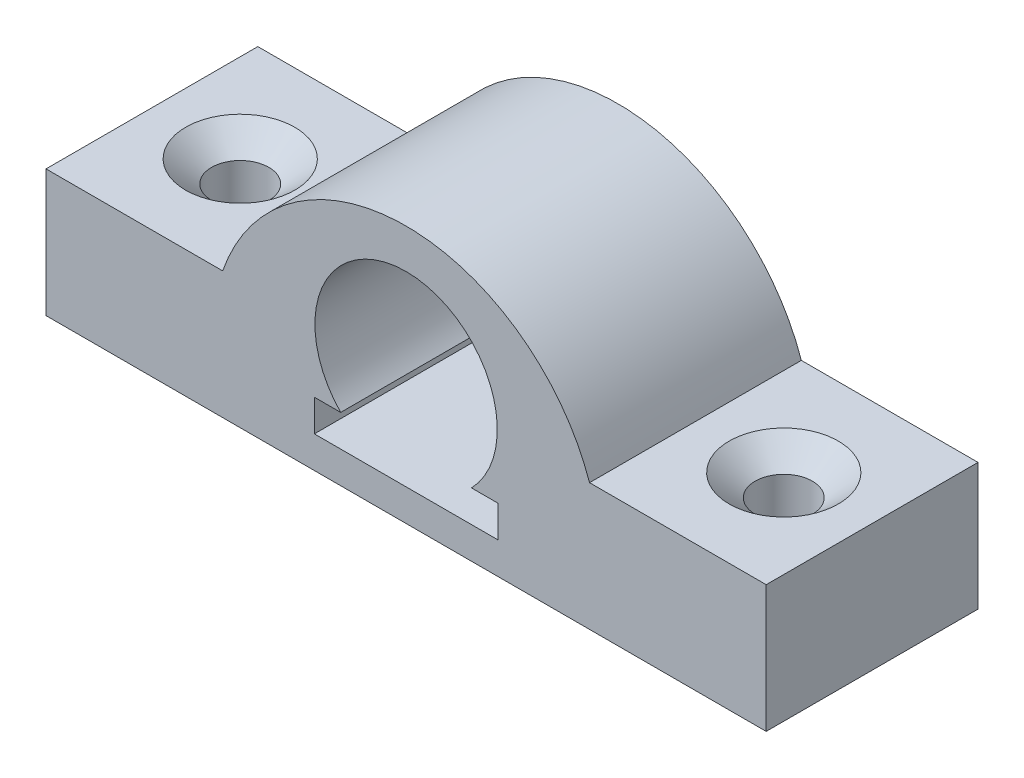
ISO-10303-21;
HEADER;
FILE_DESCRIPTION(('STEP AP214'),'2;1');
FILE_NAME('part.step','',(''),(''),'','','');
FILE_SCHEMA(('AUTOMOTIVE_DESIGN { 1 0 10303 214 1 1 1 1 }'));
ENDSEC;
DATA;
#1=APPLICATION_CONTEXT('core data for automotive mechanical design processes');
#2=APPLICATION_PROTOCOL_DEFINITION('international standard','automotive_design',2000,#1);
#3=PRODUCT_CONTEXT('',#1,'mechanical');
#4=PRODUCT('Part','Part','',(#3));
#5=PRODUCT_RELATED_PRODUCT_CATEGORY('part','',(#4));
#6=PRODUCT_DEFINITION_FORMATION('','',#4);
#7=PRODUCT_DEFINITION_CONTEXT('part definition',#1,'design');
#8=PRODUCT_DEFINITION('design','',#6,#7);
#9=PRODUCT_DEFINITION_SHAPE('','',#8);
#10=(LENGTH_UNIT() NAMED_UNIT(*) SI_UNIT(.MILLI.,.METRE.));
#11=(NAMED_UNIT(*) PLANE_ANGLE_UNIT() SI_UNIT($,.RADIAN.));
#12=(NAMED_UNIT(*) SI_UNIT($,.STERADIAN.) SOLID_ANGLE_UNIT());
#13=UNCERTAINTY_MEASURE_WITH_UNIT(LENGTH_MEASURE(1.E-05),#10,'distance_accuracy_value','');
#14=(GEOMETRIC_REPRESENTATION_CONTEXT(3) GLOBAL_UNCERTAINTY_ASSIGNED_CONTEXT((#13)) GLOBAL_UNIT_ASSIGNED_CONTEXT((#10,
#11,#12)) REPRESENTATION_CONTEXT('',''));
#15=CARTESIAN_POINT('',(0.,0.,0.));
#16=DIRECTION('',(0.,0.,1.));
#17=DIRECTION('',(1.,0.,0.));
#18=AXIS2_PLACEMENT_3D('',#15,#16,#17);
#19=CARTESIAN_POINT('',(0.,15.,0.));
#20=DIRECTION('',(0.,1.,0.));
#21=DIRECTION('',(0.,0.,1.));
#22=AXIS2_PLACEMENT_3D('',#19,#20,#21);
#23=PLANE('',#22);
#24=CARTESIAN_POINT('',(10.4246824526945,15.,-12.5));
#25=DIRECTION('',(0.,1.,0.));
#26=DIRECTION('',(0.,0.,1.));
#27=AXIS2_PLACEMENT_3D('',#24,#25,#26);
#28=CIRCLE('',#27,6.4389);
#29=CARTESIAN_POINT('',(10.4246824526945,15.,-6.06110000000001));
#30=VERTEX_POINT('',#29);
#31=EDGE_CURVE('E171',#30,#30,#28,.T.);
#32=ORIENTED_EDGE('',*,*,#31,.F.);
#33=EDGE_LOOP('',(#32));
#34=FACE_BOUND('',#33,.T.);
#35=DIRECTION('',(0.,0.,1.));
#36=VECTOR('',#35,1.);
#37=CARTESIAN_POINT('',(20.8493649053889,15.,-25.));
#38=LINE('',#37,#36);
#39=CARTESIAN_POINT('',(20.8493649053889,15.,-25.));
#40=VERTEX_POINT('',#39);
#41=CARTESIAN_POINT('',(20.8493649053889,15.,0.));
#42=VERTEX_POINT('',#41);
#43=EDGE_CURVE('E210',#40,#42,#38,.T.);
#44=ORIENTED_EDGE('',*,*,#43,.F.);
#45=DIRECTION('',(-1.,0.,0.));
#46=VECTOR('',#45,1.);
#47=CARTESIAN_POINT('',(85.,15.,-25.));
#48=LINE('',#47,#46);
#49=CARTESIAN_POINT('',(0.,15.,-25.));
#50=VERTEX_POINT('',#49);
#51=EDGE_CURVE('E234',#40,#50,#48,.T.);
#52=ORIENTED_EDGE('',*,*,#51,.T.);
#53=DIRECTION('',(0.,0.,1.));
#54=VECTOR('',#53,1.);
#55=CARTESIAN_POINT('',(0.,15.,-25.));
#56=LINE('',#55,#54);
#57=CARTESIAN_POINT('',(0.,15.,0.));
#58=VERTEX_POINT('',#57);
#59=EDGE_CURVE('E222',#50,#58,#56,.T.);
#60=ORIENTED_EDGE('',*,*,#59,.T.);
#61=DIRECTION('',(1.,0.,0.));
#62=VECTOR('',#61,1.);
#63=CARTESIAN_POINT('',(0.,15.,0.));
#64=LINE('',#63,#62);
#65=EDGE_CURVE('E228',#58,#42,#64,.T.);
#66=ORIENTED_EDGE('',*,*,#65,.T.);
#67=EDGE_LOOP('',(#44,#52,#60,#66));
#68=FACE_BOUND('',#67,.T.);
#69=ADVANCED_FACE('F45',(#34,#68),#23,.T.);
#70=CARTESIAN_POINT('',(0.,15.,-25.));
#71=DIRECTION('',(1.,0.,0.));
#72=DIRECTION('',(0.,0.,-1.));
#73=AXIS2_PLACEMENT_3D('',#70,#71,#72);
#74=PLANE('',#73);
#75=DIRECTION('',(0.,0.,1.));
#76=VECTOR('',#75,1.);
#77=CARTESIAN_POINT('',(0.,0.,-25.));
#78=LINE('',#77,#76);
#79=CARTESIAN_POINT('',(0.,0.,-25.));
#80=VERTEX_POINT('',#79);
#81=CARTESIAN_POINT('',(0.,0.,0.));
#82=VERTEX_POINT('',#81);
#83=EDGE_CURVE('E218',#80,#82,#78,.T.);
#84=ORIENTED_EDGE('',*,*,#83,.T.);
#85=DIRECTION('',(0.,-1.,0.));
#86=VECTOR('',#85,1.);
#87=CARTESIAN_POINT('',(0.,15.,0.));
#88=LINE('',#87,#86);
#89=EDGE_CURVE('E261',#58,#82,#88,.T.);
#90=ORIENTED_EDGE('',*,*,#89,.F.);
#91=ORIENTED_EDGE('',*,*,#59,.F.);
#92=DIRECTION('',(0.,-1.,0.));
#93=VECTOR('',#92,1.);
#94=CARTESIAN_POINT('',(0.,15.,-25.));
#95=LINE('',#94,#93);
#96=EDGE_CURVE('E238',#50,#80,#95,.T.);
#97=ORIENTED_EDGE('',*,*,#96,.T.);
#98=EDGE_LOOP('',(#84,#90,#91,#97));
#99=FACE_BOUND('',#98,.T.);
#100=ADVANCED_FACE('F47',(#99),#74,.F.);
#101=CARTESIAN_POINT('',(0.,15.,0.));
#102=DIRECTION('',(0.,0.,-1.));
#103=DIRECTION('',(-1.,0.,0.));
#104=AXIS2_PLACEMENT_3D('',#101,#102,#103);
#105=PLANE('',#104);
#106=DIRECTION('',(1.,0.,0.));
#107=VECTOR('',#106,1.);
#108=CARTESIAN_POINT('',(0.,7.5,0.));
#109=LINE('',#108,#107);
#110=CARTESIAN_POINT('',(31.6746824526945,7.5,0.));
#111=VERTEX_POINT('',#110);
#112=CARTESIAN_POINT('',(34.7811221654364,7.5,0.));
#113=VERTEX_POINT('',#112);
#114=EDGE_CURVE('E148',#111,#113,#109,.T.);
#115=ORIENTED_EDGE('',*,*,#114,.T.);
#116=CARTESIAN_POINT('',(42.5,15.,0.));
#117=DIRECTION('',(0.,0.,1.));
#118=DIRECTION('',(1.,0.,0.));
#119=AXIS2_PLACEMENT_3D('',#116,#117,#118);
#120=CIRCLE('',#119,10.7624846120642);
#121=CARTESIAN_POINT('',(50.2188778345637,7.5,0.));
#122=VERTEX_POINT('',#121);
#123=EDGE_CURVE('E61',#122,#113,#120,.T.);
#124=ORIENTED_EDGE('',*,*,#123,.F.);
#125=CARTESIAN_POINT('',(53.3253175473056,7.5,0.));
#126=VERTEX_POINT('',#125);
#127=EDGE_CURVE('E153',#122,#126,#109,.T.);
#128=ORIENTED_EDGE('',*,*,#127,.T.);
#129=DIRECTION('',(0.,-1.,0.));
#130=VECTOR('',#129,1.);
#131=CARTESIAN_POINT('',(53.3253175473056,0.,0.));
#132=LINE('',#131,#130);
#133=CARTESIAN_POINT('',(53.3253175473056,3.75,0.));
#134=VERTEX_POINT('',#133);
#135=EDGE_CURVE('E162',#126,#134,#132,.T.);
#136=ORIENTED_EDGE('',*,*,#135,.T.);
#137=DIRECTION('',(1.,0.,0.));
#138=VECTOR('',#137,1.);
#139=CARTESIAN_POINT('',(0.,3.75,0.));
#140=LINE('',#139,#138);
#141=CARTESIAN_POINT('',(31.6746824526945,3.75,0.));
#142=VERTEX_POINT('',#141);
#143=EDGE_CURVE('E158',#142,#134,#140,.T.);
#144=ORIENTED_EDGE('',*,*,#143,.F.);
#145=DIRECTION('',(0.,-1.,0.));
#146=VECTOR('',#145,1.);
#147=CARTESIAN_POINT('',(31.6746824526945,0.,0.));
#148=LINE('',#147,#146);
#149=EDGE_CURVE('E138',#111,#142,#148,.T.);
#150=ORIENTED_EDGE('',*,*,#149,.F.);
#151=EDGE_LOOP('',(#115,#124,#128,#136,#144,#150));
#152=FACE_BOUND('',#151,.T.);
#153=DIRECTION('',(1.,0.,0.));
#154=VECTOR('',#153,1.);
#155=CARTESIAN_POINT('',(0.,0.,0.));
#156=LINE('',#155,#154);
#157=CARTESIAN_POINT('',(85.,0.,0.));
#158=VERTEX_POINT('',#157);
#159=EDGE_CURVE('E242',#82,#158,#156,.T.);
#160=ORIENTED_EDGE('',*,*,#159,.T.);
#161=DIRECTION('',(0.,-1.,0.));
#162=VECTOR('',#161,1.);
#163=CARTESIAN_POINT('',(85.,15.,0.));
#164=LINE('',#163,#162);
#165=CARTESIAN_POINT('',(85.,15.,0.));
#166=VERTEX_POINT('',#165);
#167=EDGE_CURVE('E257',#166,#158,#164,.T.);
#168=ORIENTED_EDGE('',*,*,#167,.F.);
#169=CARTESIAN_POINT('',(64.1506350946111,15.,0.));
#170=VERTEX_POINT('',#169);
#171=EDGE_CURVE('E226',#170,#166,#64,.T.);
#172=ORIENTED_EDGE('',*,*,#171,.F.);
#173=CARTESIAN_POINT('',(42.5,7.50000000000001,0.));
#174=DIRECTION('',(0.,0.,1.));
#175=DIRECTION('',(-1.,0.,0.));
#176=AXIS2_PLACEMENT_3D('',#173,#174,#175);
#177=CIRCLE('',#176,22.9128784747793);
#178=EDGE_CURVE('E205',#170,#42,#177,.T.);
#179=ORIENTED_EDGE('',*,*,#178,.T.);
#180=ORIENTED_EDGE('',*,*,#65,.F.);
#181=ORIENTED_EDGE('',*,*,#89,.T.);
#182=EDGE_LOOP('',(#160,#168,#172,#179,#180,#181));
#183=FACE_BOUND('',#182,.T.);
#184=ADVANCED_FACE('F154',(#152,#183),#105,.F.);
#185=CARTESIAN_POINT('',(85.,15.,0.));
#186=DIRECTION('',(-1.,0.,0.));
#187=DIRECTION('',(0.,0.,1.));
#188=AXIS2_PLACEMENT_3D('',#185,#186,#187);
#189=PLANE('',#188);
#190=DIRECTION('',(0.,0.,-1.));
#191=VECTOR('',#190,1.);
#192=CARTESIAN_POINT('',(85.,0.,0.));
#193=LINE('',#192,#191);
#194=CARTESIAN_POINT('',(85.,0.,-25.));
#195=VERTEX_POINT('',#194);
#196=EDGE_CURVE('E245',#158,#195,#193,.T.);
#197=ORIENTED_EDGE('',*,*,#196,.T.);
#198=DIRECTION('',(0.,-1.,0.));
#199=VECTOR('',#198,1.);
#200=CARTESIAN_POINT('',(85.,15.,-25.));
#201=LINE('',#200,#199);
#202=CARTESIAN_POINT('',(85.,15.,-25.));
#203=VERTEX_POINT('',#202);
#204=EDGE_CURVE('E253',#203,#195,#201,.T.);
#205=ORIENTED_EDGE('',*,*,#204,.F.);
#206=DIRECTION('',(0.,0.,-1.));
#207=VECTOR('',#206,1.);
#208=CARTESIAN_POINT('',(85.,15.,0.));
#209=LINE('',#208,#207);
#210=EDGE_CURVE('E231',#166,#203,#209,.T.);
#211=ORIENTED_EDGE('',*,*,#210,.F.);
#212=ORIENTED_EDGE('',*,*,#167,.T.);
#213=EDGE_LOOP('',(#197,#205,#211,#212));
#214=FACE_BOUND('',#213,.T.);
#215=ADVANCED_FACE('F317',(#214),#189,.F.);
#216=CARTESIAN_POINT('',(85.,15.,-25.));
#217=DIRECTION('',(0.,0.,1.));
#218=DIRECTION('',(1.,0.,0.));
#219=AXIS2_PLACEMENT_3D('',#216,#217,#218);
#220=PLANE('',#219);
#221=DIRECTION('',(1.,0.,0.));
#222=VECTOR('',#221,1.);
#223=CARTESIAN_POINT('',(85.,7.5,-25.));
#224=LINE('',#223,#222);
#225=CARTESIAN_POINT('',(50.2188778345637,7.5,-25.));
#226=VERTEX_POINT('',#225);
#227=CARTESIAN_POINT('',(53.3253175473056,7.5,-25.));
#228=VERTEX_POINT('',#227);
#229=EDGE_CURVE('E54',#226,#228,#224,.T.);
#230=ORIENTED_EDGE('',*,*,#229,.F.);
#231=CARTESIAN_POINT('',(42.5,15.,-25.));
#232=DIRECTION('',(0.,0.,1.));
#233=DIRECTION('',(1.,0.,0.));
#234=AXIS2_PLACEMENT_3D('',#231,#232,#233);
#235=CIRCLE('',#234,10.7624846120642);
#236=CARTESIAN_POINT('',(34.7811221654364,7.5,-25.));
#237=VERTEX_POINT('',#236);
#238=EDGE_CURVE('E11',#226,#237,#235,.T.);
#239=ORIENTED_EDGE('',*,*,#238,.T.);
#240=DIRECTION('',(1.,0.,0.));
#241=VECTOR('',#240,1.);
#242=CARTESIAN_POINT('',(85.,7.5,-25.));
#243=LINE('',#242,#241);
#244=CARTESIAN_POINT('',(31.6746824526945,7.5,-25.));
#245=VERTEX_POINT('',#244);
#246=EDGE_CURVE('E265',#245,#237,#243,.T.);
#247=ORIENTED_EDGE('',*,*,#246,.F.);
#248=DIRECTION('',(0.,-1.,0.));
#249=VECTOR('',#248,1.);
#250=CARTESIAN_POINT('',(31.6746824526945,15.,-25.));
#251=LINE('',#250,#249);
#252=CARTESIAN_POINT('',(31.6746824526945,3.75,-25.));
#253=VERTEX_POINT('',#252);
#254=EDGE_CURVE('E141',#245,#253,#251,.T.);
#255=ORIENTED_EDGE('',*,*,#254,.T.);
#256=DIRECTION('',(1.,0.,0.));
#257=VECTOR('',#256,1.);
#258=CARTESIAN_POINT('',(85.,3.75,-25.));
#259=LINE('',#258,#257);
#260=CARTESIAN_POINT('',(53.3253175473056,3.75,-25.));
#261=VERTEX_POINT('',#260);
#262=EDGE_CURVE('E270',#253,#261,#259,.T.);
#263=ORIENTED_EDGE('',*,*,#262,.T.);
#264=DIRECTION('',(0.,-1.,0.));
#265=VECTOR('',#264,1.);
#266=CARTESIAN_POINT('',(53.3253175473056,15.,-25.));
#267=LINE('',#266,#265);
#268=EDGE_CURVE('E274',#228,#261,#267,.T.);
#269=ORIENTED_EDGE('',*,*,#268,.F.);
#270=EDGE_LOOP('',(#230,#239,#247,#255,#263,#269));
#271=FACE_BOUND('',#270,.T.);
#272=DIRECTION('',(-1.,0.,0.));
#273=VECTOR('',#272,1.);
#274=CARTESIAN_POINT('',(85.,0.,-25.));
#275=LINE('',#274,#273);
#276=EDGE_CURVE('E227',#195,#80,#275,.T.);
#277=ORIENTED_EDGE('',*,*,#276,.T.);
#278=ORIENTED_EDGE('',*,*,#96,.F.);
#279=ORIENTED_EDGE('',*,*,#51,.F.);
#280=CARTESIAN_POINT('',(42.5,7.50000000000001,-25.));
#281=DIRECTION('',(0.,0.,1.));
#282=DIRECTION('',(-1.,0.,0.));
#283=AXIS2_PLACEMENT_3D('',#280,#281,#282);
#284=CIRCLE('',#283,22.9128784747793);
#285=CARTESIAN_POINT('',(64.1506350946111,15.,-25.));
#286=VERTEX_POINT('',#285);
#287=EDGE_CURVE('E206',#286,#40,#284,.T.);
#288=ORIENTED_EDGE('',*,*,#287,.F.);
#289=EDGE_CURVE('E235',#203,#286,#48,.T.);
#290=ORIENTED_EDGE('',*,*,#289,.F.);
#291=ORIENTED_EDGE('',*,*,#204,.T.);
#292=EDGE_LOOP('',(#277,#278,#279,#288,#290,#291));
#293=FACE_BOUND('',#292,.T.);
#294=ADVANCED_FACE('F290',(#271,#293),#220,.F.);
#295=CARTESIAN_POINT('',(74.5753175473055,15.,-12.5));
#296=DIRECTION('',(0.,1.,0.));
#297=DIRECTION('',(0.,0.,1.));
#298=AXIS2_PLACEMENT_3D('',#295,#296,#297);
#299=CIRCLE('',#298,6.4389);
#300=CARTESIAN_POINT('',(74.5753175473055,15.,-6.06110000000001));
#301=VERTEX_POINT('',#300);
#302=EDGE_CURVE('E193',#301,#301,#299,.T.);
#303=ORIENTED_EDGE('',*,*,#302,.F.);
#304=EDGE_LOOP('',(#303));
#305=FACE_BOUND('',#304,.T.);
#306=DIRECTION('',(0.,0.,1.));
#307=VECTOR('',#306,1.);
#308=CARTESIAN_POINT('',(64.1506350946111,15.,-25.));
#309=LINE('',#308,#307);
#310=EDGE_CURVE('E214',#286,#170,#309,.T.);
#311=ORIENTED_EDGE('',*,*,#310,.T.);
#312=ORIENTED_EDGE('',*,*,#171,.T.);
#313=ORIENTED_EDGE('',*,*,#210,.T.);
#314=ORIENTED_EDGE('',*,*,#289,.T.);
#315=EDGE_LOOP('',(#311,#312,#313,#314));
#316=FACE_BOUND('',#315,.T.);
#317=ADVANCED_FACE('F314',(#305,#316),#23,.T.);
#318=CARTESIAN_POINT('',(0.,0.,0.));
#319=DIRECTION('',(0.,1.,0.));
#320=DIRECTION('',(0.,0.,1.));
#321=AXIS2_PLACEMENT_3D('',#318,#319,#320);
#322=PLANE('',#321);
#323=CARTESIAN_POINT('',(10.4246824526945,0.,-12.5));
#324=DIRECTION('',(0.,1.,0.));
#325=DIRECTION('',(0.,0.,1.));
#326=AXIS2_PLACEMENT_3D('',#323,#324,#325);
#327=CIRCLE('',#326,3.3782);
#328=CARTESIAN_POINT('',(10.4246824526945,0.,-9.12180000000001));
#329=VERTEX_POINT('',#328);
#330=EDGE_CURVE('E189',#329,#329,#327,.T.);
#331=ORIENTED_EDGE('',*,*,#330,.T.);
#332=EDGE_LOOP('',(#331));
#333=FACE_BOUND('',#332,.T.);
#334=CARTESIAN_POINT('',(74.5753175473055,0.,-12.5));
#335=DIRECTION('',(0.,1.,0.));
#336=DIRECTION('',(0.,0.,1.));
#337=AXIS2_PLACEMENT_3D('',#334,#335,#336);
#338=CIRCLE('',#337,3.3782);
#339=CARTESIAN_POINT('',(74.5753175473055,0.,-9.12180000000001));
#340=VERTEX_POINT('',#339);
#341=EDGE_CURVE('E201',#340,#340,#338,.T.);
#342=ORIENTED_EDGE('',*,*,#341,.T.);
#343=EDGE_LOOP('',(#342));
#344=FACE_BOUND('',#343,.T.);
#345=ORIENTED_EDGE('',*,*,#83,.F.);
#346=ORIENTED_EDGE('',*,*,#276,.F.);
#347=ORIENTED_EDGE('',*,*,#196,.F.);
#348=ORIENTED_EDGE('',*,*,#159,.F.);
#349=EDGE_LOOP('',(#345,#346,#347,#348));
#350=FACE_BOUND('',#349,.T.);
#351=ADVANCED_FACE('F320',(#333,#344,#350),#322,.F.);
#352=CARTESIAN_POINT('',(42.5,7.50000000000001,-25.));
#353=DIRECTION('',(0.,0.,1.));
#354=DIRECTION('',(1.,0.,0.));
#355=AXIS2_PLACEMENT_3D('',#352,#353,#354);
#356=CYLINDRICAL_SURFACE('',#355,22.9128784747793);
#357=ORIENTED_EDGE('',*,*,#178,.F.);
#358=ORIENTED_EDGE('',*,*,#310,.F.);
#359=ORIENTED_EDGE('',*,*,#287,.T.);
#360=ORIENTED_EDGE('',*,*,#43,.T.);
#361=EDGE_LOOP('',(#357,#358,#359,#360));
#362=FACE_BOUND('',#361,.T.);
#363=ADVANCED_FACE('F309',(#362),#356,.T.);
#364=CARTESIAN_POINT('',(74.5753175473055,15.,-12.5));
#365=DIRECTION('',(0.,1.,0.));
#366=DIRECTION('',(0.,0.,1.));
#367=AXIS2_PLACEMENT_3D('',#364,#365,#366);
#368=CYLINDRICAL_SURFACE('',#367,3.3782);
#369=ORIENTED_EDGE('',*,*,#341,.F.);
#370=EDGE_LOOP('',(#369));
#371=FACE_BOUND('',#370,.T.);
#372=CARTESIAN_POINT('',(74.5753175473055,12.4317677588557,-12.5));
#373=DIRECTION('',(0.,1.,0.));
#374=DIRECTION('',(0.,0.,1.));
#375=AXIS2_PLACEMENT_3D('',#372,#373,#374);
#376=CIRCLE('',#375,3.3782);
#377=CARTESIAN_POINT('',(74.5753175473055,12.4317677588557,-9.12180000000001));
#378=VERTEX_POINT('',#377);
#379=EDGE_CURVE('E197',#378,#378,#376,.T.);
#380=ORIENTED_EDGE('',*,*,#379,.T.);
#381=EDGE_LOOP('',(#380));
#382=FACE_BOUND('',#381,.T.);
#383=ADVANCED_FACE('F329',(#371,#382),#368,.F.);
#384=CARTESIAN_POINT('',(74.5753175473055,15.,-12.5));
#385=DIRECTION('',(0.,1.,0.));
#386=DIRECTION('',(0.,0.,1.));
#387=AXIS2_PLACEMENT_3D('',#384,#385,#386);
#388=CONICAL_SURFACE('',#387,6.4389,0.872664625997165);
#389=ORIENTED_EDGE('',*,*,#379,.F.);
#390=EDGE_LOOP('',(#389));
#391=FACE_BOUND('',#390,.T.);
#392=ORIENTED_EDGE('',*,*,#302,.T.);
#393=EDGE_LOOP('',(#392));
#394=FACE_BOUND('',#393,.T.);
#395=ADVANCED_FACE('F343',(#391,#394),#388,.F.);
#396=CARTESIAN_POINT('',(10.4246824526945,15.,-12.5));
#397=DIRECTION('',(0.,1.,0.));
#398=DIRECTION('',(0.,0.,1.));
#399=AXIS2_PLACEMENT_3D('',#396,#397,#398);
#400=CYLINDRICAL_SURFACE('',#399,3.3782);
#401=ORIENTED_EDGE('',*,*,#330,.F.);
#402=EDGE_LOOP('',(#401));
#403=FACE_BOUND('',#402,.T.);
#404=CARTESIAN_POINT('',(10.4246824526945,12.4317677588557,-12.5));
#405=DIRECTION('',(0.,1.,0.));
#406=DIRECTION('',(0.,0.,1.));
#407=AXIS2_PLACEMENT_3D('',#404,#405,#406);
#408=CIRCLE('',#407,3.3782);
#409=CARTESIAN_POINT('',(10.4246824526945,12.4317677588557,-9.12180000000001));
#410=VERTEX_POINT('',#409);
#411=EDGE_CURVE('E185',#410,#410,#408,.T.);
#412=ORIENTED_EDGE('',*,*,#411,.T.);
#413=EDGE_LOOP('',(#412));
#414=FACE_BOUND('',#413,.T.);
#415=ADVANCED_FACE('F347',(#403,#414),#400,.F.);
#416=CARTESIAN_POINT('',(10.4246824526945,15.,-12.5));
#417=DIRECTION('',(0.,1.,0.));
#418=DIRECTION('',(0.,0.,1.));
#419=AXIS2_PLACEMENT_3D('',#416,#417,#418);
#420=CONICAL_SURFACE('',#419,6.4389,0.872664625997165);
#421=ORIENTED_EDGE('',*,*,#411,.F.);
#422=EDGE_LOOP('',(#421));
#423=FACE_BOUND('',#422,.T.);
#424=ORIENTED_EDGE('',*,*,#31,.T.);
#425=EDGE_LOOP('',(#424));
#426=FACE_BOUND('',#425,.T.);
#427=ADVANCED_FACE('F351',(#423,#426),#420,.F.);
#428=CARTESIAN_POINT('',(42.5,15.,-55.));
#429=DIRECTION('',(0.,0.,1.));
#430=DIRECTION('',(1.,0.,0.));
#431=AXIS2_PLACEMENT_3D('',#428,#429,#430);
#432=CYLINDRICAL_SURFACE('',#431,10.7624846120642);
#433=DIRECTION('',(0.,0.,1.));
#434=VECTOR('',#433,1.);
#435=CARTESIAN_POINT('',(50.2188778345637,7.5,-55.));
#436=LINE('',#435,#434);
#437=EDGE_CURVE('E168',#226,#122,#436,.T.);
#438=ORIENTED_EDGE('',*,*,#437,.T.);
#439=ORIENTED_EDGE('',*,*,#123,.T.);
#440=DIRECTION('',(0.,0.,1.));
#441=VECTOR('',#440,1.);
#442=CARTESIAN_POINT('',(34.7811221654364,7.5,-55.));
#443=LINE('',#442,#441);
#444=EDGE_CURVE('E145',#237,#113,#443,.T.);
#445=ORIENTED_EDGE('',*,*,#444,.F.);
#446=ORIENTED_EDGE('',*,*,#238,.F.);
#447=EDGE_LOOP('',(#438,#439,#445,#446));
#448=FACE_BOUND('',#447,.T.);
#449=ADVANCED_FACE('F355',(#448),#432,.F.);
#450=CARTESIAN_POINT('',(0.,7.5,-55.));
#451=DIRECTION('',(0.,-1.,0.));
#452=DIRECTION('',(0.,0.,-1.));
#453=AXIS2_PLACEMENT_3D('',#450,#451,#452);
#454=PLANE('',#453);
#455=ORIENTED_EDGE('',*,*,#229,.T.);
#456=DIRECTION('',(0.,0.,1.));
#457=VECTOR('',#456,1.);
#458=CARTESIAN_POINT('',(53.3253175473056,7.5,-55.));
#459=LINE('',#458,#457);
#460=EDGE_CURVE('E172',#228,#126,#459,.T.);
#461=ORIENTED_EDGE('',*,*,#460,.T.);
#462=ORIENTED_EDGE('',*,*,#127,.F.);
#463=ORIENTED_EDGE('',*,*,#437,.F.);
#464=EDGE_LOOP('',(#455,#461,#462,#463));
#465=FACE_BOUND('',#464,.T.);
#466=ADVANCED_FACE('F281',(#465),#454,.T.);
#467=CARTESIAN_POINT('',(53.3253175473056,0.,-55.));
#468=DIRECTION('',(-1.,0.,0.));
#469=DIRECTION('',(0.,0.,1.));
#470=AXIS2_PLACEMENT_3D('',#467,#468,#469);
#471=PLANE('',#470);
#472=ORIENTED_EDGE('',*,*,#268,.T.);
#473=DIRECTION('',(0.,0.,1.));
#474=VECTOR('',#473,1.);
#475=CARTESIAN_POINT('',(53.3253175473056,3.75,-55.));
#476=LINE('',#475,#474);
#477=EDGE_CURVE('E175',#261,#134,#476,.T.);
#478=ORIENTED_EDGE('',*,*,#477,.T.);
#479=ORIENTED_EDGE('',*,*,#135,.F.);
#480=ORIENTED_EDGE('',*,*,#460,.F.);
#481=EDGE_LOOP('',(#472,#478,#479,#480));
#482=FACE_BOUND('',#481,.T.);
#483=ADVANCED_FACE('F287',(#482),#471,.T.);
#484=CARTESIAN_POINT('',(0.,3.75,-55.));
#485=DIRECTION('',(0.,-1.,0.));
#486=DIRECTION('',(0.,0.,-1.));
#487=AXIS2_PLACEMENT_3D('',#484,#485,#486);
#488=PLANE('',#487);
#489=DIRECTION('',(0.,0.,1.));
#490=VECTOR('',#489,1.);
#491=CARTESIAN_POINT('',(31.6746824526945,3.75,-55.));
#492=LINE('',#491,#490);
#493=EDGE_CURVE('E144',#253,#142,#492,.T.);
#494=ORIENTED_EDGE('',*,*,#493,.T.);
#495=ORIENTED_EDGE('',*,*,#143,.T.);
#496=ORIENTED_EDGE('',*,*,#477,.F.);
#497=ORIENTED_EDGE('',*,*,#262,.F.);
#498=EDGE_LOOP('',(#494,#495,#496,#497));
#499=FACE_BOUND('',#498,.T.);
#500=ADVANCED_FACE('F293',(#499),#488,.F.);
#501=CARTESIAN_POINT('',(31.6746824526945,0.,-55.));
#502=DIRECTION('',(-1.,0.,0.));
#503=DIRECTION('',(0.,0.,1.));
#504=AXIS2_PLACEMENT_3D('',#501,#502,#503);
#505=PLANE('',#504);
#506=DIRECTION('',(0.,0.,1.));
#507=VECTOR('',#506,1.);
#508=CARTESIAN_POINT('',(31.6746824526945,7.5,-55.));
#509=LINE('',#508,#507);
#510=EDGE_CURVE('E69',#245,#111,#509,.T.);
#511=ORIENTED_EDGE('',*,*,#510,.T.);
#512=ORIENTED_EDGE('',*,*,#149,.T.);
#513=ORIENTED_EDGE('',*,*,#493,.F.);
#514=ORIENTED_EDGE('',*,*,#254,.F.);
#515=EDGE_LOOP('',(#511,#512,#513,#514));
#516=FACE_BOUND('',#515,.T.);
#517=ADVANCED_FACE('F135',(#516),#505,.F.);
#518=ORIENTED_EDGE('',*,*,#246,.T.);
#519=ORIENTED_EDGE('',*,*,#444,.T.);
#520=ORIENTED_EDGE('',*,*,#114,.F.);
#521=ORIENTED_EDGE('',*,*,#510,.F.);
#522=EDGE_LOOP('',(#518,#519,#520,#521));
#523=FACE_BOUND('',#522,.T.);
#524=ADVANCED_FACE('F149',(#523),#454,.T.);
#525=CLOSED_SHELL('',(#69,#100,#184,#215,#294,#317,#351,#363,#383,#395,#415,#427,#449,#466,#483,
#500,#517,#524));
#526=MANIFOLD_SOLID_BREP('B2',#525);
#527=ADVANCED_BREP_SHAPE_REPRESENTATION('',(#18,#526),#14);
#528=SHAPE_DEFINITION_REPRESENTATION(#9,#527);
ENDSEC;
END-ISO-10303-21;
